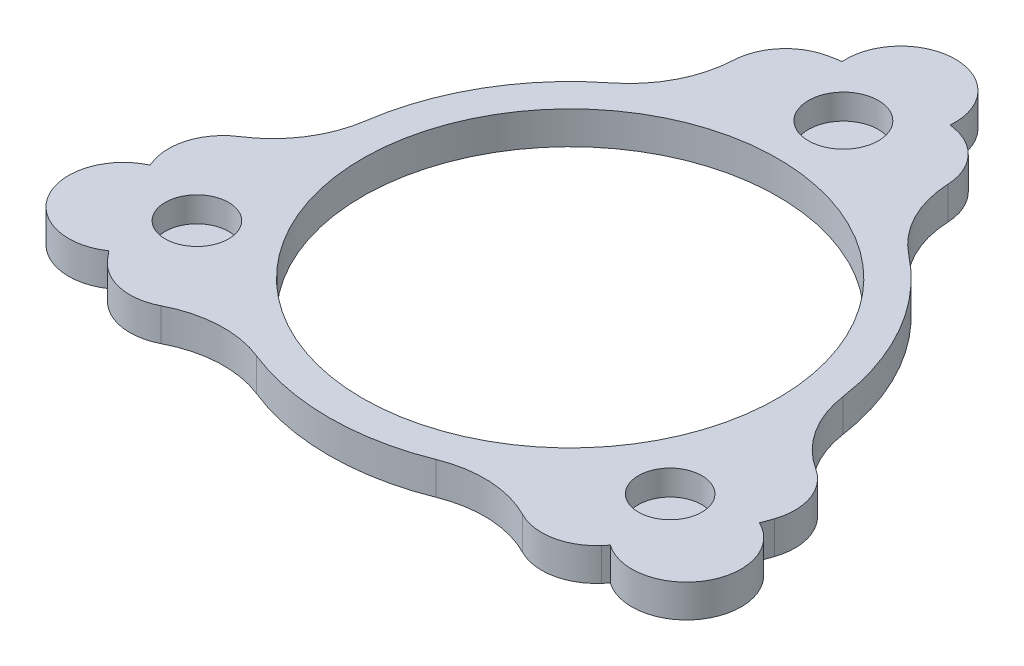
ISO-10303-21;
HEADER;
FILE_DESCRIPTION(('STEP AP214'),'2;1');
FILE_NAME('part.step','',(''),(''),'','','');
FILE_SCHEMA(('AUTOMOTIVE_DESIGN { 1 0 10303 214 1 1 1 1 }'));
ENDSEC;
DATA;
#1=APPLICATION_CONTEXT('core data for automotive mechanical design processes');
#2=APPLICATION_PROTOCOL_DEFINITION('international standard','automotive_design',2000,#1);
#3=PRODUCT_CONTEXT('',#1,'mechanical');
#4=PRODUCT('Part','Part','',(#3));
#5=PRODUCT_RELATED_PRODUCT_CATEGORY('part','',(#4));
#6=PRODUCT_DEFINITION_FORMATION('','',#4);
#7=PRODUCT_DEFINITION_CONTEXT('part definition',#1,'design');
#8=PRODUCT_DEFINITION('design','',#6,#7);
#9=PRODUCT_DEFINITION_SHAPE('','',#8);
#10=(LENGTH_UNIT() NAMED_UNIT(*) SI_UNIT(.MILLI.,.METRE.));
#11=(NAMED_UNIT(*) PLANE_ANGLE_UNIT() SI_UNIT($,.RADIAN.));
#12=(NAMED_UNIT(*) SI_UNIT($,.STERADIAN.) SOLID_ANGLE_UNIT());
#13=UNCERTAINTY_MEASURE_WITH_UNIT(LENGTH_MEASURE(1.E-05),#10,'distance_accuracy_value','');
#14=(GEOMETRIC_REPRESENTATION_CONTEXT(3) GLOBAL_UNCERTAINTY_ASSIGNED_CONTEXT((#13)) GLOBAL_UNIT_ASSIGNED_CONTEXT((#10,
#11,#12)) REPRESENTATION_CONTEXT('',''));
#15=CARTESIAN_POINT('',(0.,0.,0.));
#16=DIRECTION('',(0.,0.,1.));
#17=DIRECTION('',(1.,0.,0.));
#18=AXIS2_PLACEMENT_3D('',#15,#16,#17);
#19=CARTESIAN_POINT('',(0.,3.,0.));
#20=DIRECTION('',(0.,-1.,0.));
#21=DIRECTION('',(0.,0.,-1.));
#22=AXIS2_PLACEMENT_3D('',#19,#20,#21);
#23=CYLINDRICAL_SURFACE('',#22,30.);
#24=CARTESIAN_POINT('',(0.,3.,0.));
#25=DIRECTION('',(0.,1.,0.));
#26=DIRECTION('',(0.,0.,1.));
#27=AXIS2_PLACEMENT_3D('',#24,#25,#26);
#28=CIRCLE('',#27,30.);
#29=CARTESIAN_POINT('',(22.5987122307723,3.,19.7306412848327));
#30=VERTEX_POINT('',#29);
#31=CARTESIAN_POINT('',(22.9708708954916,3.,19.2960900262892));
#32=VERTEX_POINT('',#31);
#33=EDGE_CURVE('E250',#30,#32,#28,.T.);
#34=ORIENTED_EDGE('',*,*,#33,.F.);
#35=DIRECTION('',(0.,-1.,0.));
#36=VECTOR('',#35,1.);
#37=CARTESIAN_POINT('',(22.5987122307723,3.,19.7306412848327));
#38=LINE('',#37,#36);
#39=CARTESIAN_POINT('',(22.5987122307723,0.,19.7306412848327));
#40=VERTEX_POINT('',#39);
#41=EDGE_CURVE('E393',#30,#40,#38,.T.);
#42=ORIENTED_EDGE('',*,*,#41,.T.);
#43=CARTESIAN_POINT('',(0.,0.,0.));
#44=DIRECTION('',(0.,1.,0.));
#45=DIRECTION('',(0.,0.,1.));
#46=AXIS2_PLACEMENT_3D('',#43,#44,#45);
#47=CIRCLE('',#46,30.);
#48=CARTESIAN_POINT('',(22.9708708954916,0.,19.2960900262892));
#49=VERTEX_POINT('',#48);
#50=EDGE_CURVE('E220',#40,#49,#47,.T.);
#51=ORIENTED_EDGE('',*,*,#50,.T.);
#52=DIRECTION('',(0.,1.,0.));
#53=VECTOR('',#52,1.);
#54=CARTESIAN_POINT('',(22.9708708954916,1.5,19.2960900262892));
#55=LINE('',#54,#53);
#56=EDGE_CURVE('E206',#49,#32,#55,.T.);
#57=ORIENTED_EDGE('',*,*,#56,.T.);
#58=EDGE_LOOP('',(#34,#42,#51,#57));
#59=FACE_BOUND('',#58,.T.);
#60=ADVANCED_FACE('F35',(#59),#23,.T.);
#61=CARTESIAN_POINT('',(5.78788047023686,3.,-29.4363795270793));
#62=VERTEX_POINT('',#61);
#63=CARTESIAN_POINT('',(5.22546870873223,3.,-29.5414027556929));
#64=VERTEX_POINT('',#63);
#65=EDGE_CURVE('E243',#62,#64,#28,.T.);
#66=ORIENTED_EDGE('',*,*,#65,.F.);
#67=DIRECTION('',(0.,-1.,0.));
#68=VECTOR('',#67,1.);
#69=CARTESIAN_POINT('',(5.78788047023686,3.,-29.4363795270793));
#70=LINE('',#69,#68);
#71=CARTESIAN_POINT('',(5.78788047023686,0.,-29.4363795270793));
#72=VERTEX_POINT('',#71);
#73=EDGE_CURVE('E11',#62,#72,#70,.T.);
#74=ORIENTED_EDGE('',*,*,#73,.T.);
#75=CARTESIAN_POINT('',(5.22546870873223,0.,-29.5414027556929));
#76=VERTEX_POINT('',#75);
#77=EDGE_CURVE('E221',#72,#76,#47,.T.);
#78=ORIENTED_EDGE('',*,*,#77,.T.);
#79=DIRECTION('',(0.,1.,0.));
#80=VECTOR('',#79,1.);
#81=CARTESIAN_POINT('',(5.22546870873223,1.5,-29.5414027556929));
#82=LINE('',#81,#80);
#83=EDGE_CURVE('E273',#76,#64,#82,.T.);
#84=ORIENTED_EDGE('',*,*,#83,.T.);
#85=EDGE_LOOP('',(#66,#74,#78,#84));
#86=FACE_BOUND('',#85,.T.);
#87=ADVANCED_FACE('F442',(#86),#23,.T.);
#88=CARTESIAN_POINT('',(0.,3.,0.));
#89=DIRECTION('',(0.,1.,0.));
#90=DIRECTION('',(0.,0.,1.));
#91=AXIS2_PLACEMENT_3D('',#88,#89,#90);
#92=PLANE('',#91);
#93=CARTESIAN_POINT('',(1.60090602130669E-12,3.,-24.9999999999991));
#94=DIRECTION('',(0.,1.,0.));
#95=DIRECTION('',(0.,0.,1.));
#96=AXIS2_PLACEMENT_3D('',#93,#94,#95);
#97=CIRCLE('',#96,3.2);
#98=CARTESIAN_POINT('',(1.60090602130669E-12,3.,-21.7999999999991));
#99=VERTEX_POINT('',#98);
#100=EDGE_CURVE('E422',#99,#99,#97,.T.);
#101=ORIENTED_EDGE('',*,*,#100,.F.);
#102=EDGE_LOOP('',(#101));
#103=FACE_BOUND('',#102,.T.);
#104=CARTESIAN_POINT('',(21.650635094611,3.,12.5000000000018));
#105=DIRECTION('',(0.,1.,0.));
#106=DIRECTION('',(0.,0.,1.));
#107=AXIS2_PLACEMENT_3D('',#104,#105,#106);
#108=CIRCLE('',#107,2.9);
#109=CARTESIAN_POINT('',(21.650635094611,3.,15.4000000000018));
#110=VERTEX_POINT('',#109);
#111=EDGE_CURVE('E428',#110,#110,#108,.T.);
#112=ORIENTED_EDGE('',*,*,#111,.F.);
#113=EDGE_LOOP('',(#112));
#114=FACE_BOUND('',#113,.T.);
#115=CARTESIAN_POINT('',(-21.650635094611,3.,12.5));
#116=DIRECTION('',(0.,1.,0.));
#117=DIRECTION('',(0.,0.,1.));
#118=AXIS2_PLACEMENT_3D('',#115,#116,#117);
#119=CIRCLE('',#118,2.9);
#120=CARTESIAN_POINT('',(-21.650635094611,3.,15.4));
#121=VERTEX_POINT('',#120);
#122=EDGE_CURVE('E415',#121,#121,#119,.T.);
#123=ORIENTED_EDGE('',*,*,#122,.F.);
#124=EDGE_LOOP('',(#123));
#125=FACE_BOUND('',#124,.T.);
#126=CARTESIAN_POINT('',(0.,3.,0.));
#127=DIRECTION('',(0.,1.,0.));
#128=DIRECTION('',(0.,0.,1.));
#129=AXIS2_PLACEMENT_3D('',#126,#127,#128);
#130=CIRCLE('',#129,19.);
#131=CARTESIAN_POINT('',(0.,3.,19.));
#132=VERTEX_POINT('',#131);
#133=EDGE_CURVE('E260',#132,#132,#130,.T.);
#134=ORIENTED_EDGE('',*,*,#133,.F.);
#135=EDGE_LOOP('',(#134));
#136=FACE_BOUND('',#135,.T.);
#137=CARTESIAN_POINT('',(-4.73941231097717,3.,-29.6232673914705));
#138=VERTEX_POINT('',#137);
#139=CARTESIAN_POINT('',(-5.78788047023531,3.,-29.4363795270796));
#140=VERTEX_POINT('',#139);
#141=EDGE_CURVE('E242',#138,#140,#28,.T.);
#142=ORIENTED_EDGE('',*,*,#141,.T.);
#143=CARTESIAN_POINT('',(-4.82323372519609,3.,-24.5303162725663));
#144=DIRECTION('',(0.,1.,0.));
#145=DIRECTION('',(0.,0.,1.));
#146=AXIS2_PLACEMENT_3D('',#143,#144,#145);
#147=CIRCLE('',#146,5.);
#148=CARTESIAN_POINT('',(-9.81802138609295,3.,-24.7585622419778));
#149=VERTEX_POINT('',#148);
#150=EDGE_CURVE('E366',#140,#149,#147,.T.);
#151=ORIENTED_EDGE('',*,*,#150,.T.);
#152=CARTESIAN_POINT('',(-19.8075967078866,3.,-25.2150541808007));
#153=DIRECTION('',(0.,1.,0.));
#154=DIRECTION('',(0.,0.,1.));
#155=AXIS2_PLACEMENT_3D('',#152,#153,#154);
#156=CIRCLE('',#155,10.);
#157=CARTESIAN_POINT('',(-13.6301971895271,3.,-17.3512297174386));
#158=VERTEX_POINT('',#157);
#159=EDGE_CURVE('E351',#149,#158,#156,.F.);
#160=ORIENTED_EDGE('',*,*,#159,.T.);
#161=CARTESIAN_POINT('',(0.,3.,0.));
#162=DIRECTION('',(0.,1.,0.));
#163=DIRECTION('',(0.,0.,1.));
#164=AXIS2_PLACEMENT_3D('',#161,#162,#163);
#165=CIRCLE('',#164,22.0646198275139);
#166=CARTESIAN_POINT('',(-21.8417043169647,3.,-3.12848216600344));
#167=VERTEX_POINT('',#166);
#168=EDGE_CURVE('E411',#158,#167,#165,.T.);
#169=ORIENTED_EDGE('',*,*,#168,.T.);
#170=CARTESIAN_POINT('',(-31.7406758323175,3.,-4.54635484654804));
#171=DIRECTION('',(0.,1.,0.));
#172=DIRECTION('',(0.,0.,1.));
#173=AXIS2_PLACEMENT_3D('',#170,#171,#172);
#174=CIRCLE('',#173,10.);
#175=CARTESIAN_POINT('',(-26.3505545557776,3.,3.87662518573222));
#176=VERTEX_POINT('',#175);
#177=EDGE_CURVE('E327',#167,#176,#174,.F.);
#178=ORIENTED_EDGE('',*,*,#177,.T.);
#179=CARTESIAN_POINT('',(-23.6554939175076,3.,8.08811520187234));
#180=DIRECTION('',(0.,1.,0.));
#181=DIRECTION('',(0.,0.,1.));
#182=AXIS2_PLACEMENT_3D('',#179,#180,#181);
#183=CIRCLE('',#182,5.);
#184=CARTESIAN_POINT('',(-28.3865927010092,3.,9.70573824224681));
#185=VERTEX_POINT('',#184);
#186=EDGE_CURVE('E364',#176,#185,#183,.T.);
#187=ORIENTED_EDGE('',*,*,#186,.T.);
#188=CARTESIAN_POINT('',(-28.1963396042238,3.,10.2453127294037));
#189=VERTEX_POINT('',#188);
#190=EDGE_CURVE('E236',#185,#189,#28,.T.);
#191=ORIENTED_EDGE('',*,*,#190,.T.);
#192=CARTESIAN_POINT('',(-26.1031109845426,3.,14.7860608996667));
#193=DIRECTION('',(0.,1.,0.));
#194=DIRECTION('',(0.,0.,1.));
#195=AXIS2_PLACEMENT_3D('',#192,#193,#194);
#196=CIRCLE('',#195,5.);
#197=CARTESIAN_POINT('',(-23.284795948624,3.,18.9160851560502));
#198=VERTEX_POINT('',#197);
#199=EDGE_CURVE('E276',#189,#198,#196,.T.);
#200=ORIENTED_EDGE('',*,*,#199,.T.);
#201=CARTESIAN_POINT('',(-22.5987122307734,3.,19.7306412848314));
#202=VERTEX_POINT('',#201);
#203=EDGE_CURVE('E244',#198,#202,#28,.T.);
#204=ORIENTED_EDGE('',*,*,#203,.T.);
#205=CARTESIAN_POINT('',(-18.8322601923112,3.,16.4422010706928));
#206=DIRECTION('',(0.,1.,0.));
#207=DIRECTION('',(0.,0.,1.));
#208=AXIS2_PLACEMENT_3D('',#205,#206,#207);
#209=CIRCLE('',#208,5.);
#210=CARTESIAN_POINT('',(-16.5325331696845,3.,20.8819370562443));
#211=VERTEX_POINT('',#210);
#212=EDGE_CURVE('E362',#202,#211,#209,.T.);
#213=ORIENTED_EDGE('',*,*,#212,.T.);
#214=CARTESIAN_POINT('',(-11.9330791244311,3.,29.7614090273472));
#215=DIRECTION('',(0.,1.,0.));
#216=DIRECTION('',(0.,0.,1.));
#217=AXIS2_PLACEMENT_3D('',#214,#215,#216);
#218=CIRCLE('',#217,10.);
#219=CARTESIAN_POINT('',(-8.21150712743779,3.,20.479711883441));
#220=VERTEX_POINT('',#219);
#221=EDGE_CURVE('E332',#211,#220,#218,.F.);
#222=ORIENTED_EDGE('',*,*,#221,.T.);
#223=CARTESIAN_POINT('',(0.,3.,0.));
#224=DIRECTION('',(0.,1.,0.));
#225=DIRECTION('',(0.,0.,1.));
#226=AXIS2_PLACEMENT_3D('',#223,#224,#225);
#227=CIRCLE('',#226,22.0646198275139);
#228=CARTESIAN_POINT('',(8.21150712743663,3.,20.4797118834415));
#229=VERTEX_POINT('',#228);
#230=EDGE_CURVE('E412',#220,#229,#227,.T.);
#231=ORIENTED_EDGE('',*,*,#230,.T.);
#232=CARTESIAN_POINT('',(11.9330791244294,3.,29.7614090273479));
#233=DIRECTION('',(0.,1.,0.));
#234=DIRECTION('',(0.,0.,1.));
#235=AXIS2_PLACEMENT_3D('',#232,#233,#234);
#236=CIRCLE('',#235,10.);
#237=CARTESIAN_POINT('',(16.5325331696833,3.,20.8819370562452));
#238=VERTEX_POINT('',#237);
#239=EDGE_CURVE('E337',#229,#238,#236,.F.);
#240=ORIENTED_EDGE('',*,*,#239,.T.);
#241=CARTESIAN_POINT('',(18.8322601923102,3.,16.4422010706939));
#242=DIRECTION('',(0.,1.,0.));
#243=DIRECTION('',(0.,0.,1.));
#244=AXIS2_PLACEMENT_3D('',#241,#242,#243);
#245=CIRCLE('',#244,5.);
#246=EDGE_CURVE('E360',#238,#30,#245,.T.);
#247=ORIENTED_EDGE('',*,*,#246,.T.);
#248=ORIENTED_EDGE('',*,*,#33,.T.);
#249=CARTESIAN_POINT('',(25.8566598532865,3.,15.2129267805851));
#250=DIRECTION('',(0.,1.,0.));
#251=DIRECTION('',(0.,0.,1.));
#252=AXIS2_PLACEMENT_3D('',#249,#250,#251);
#253=CIRCLE('',#252,5.);
#254=CARTESIAN_POINT('',(28.0242082596012,3.,10.7071822354203));
#255=VERTEX_POINT('',#254);
#256=EDGE_CURVE('E208',#32,#255,#253,.T.);
#257=ORIENTED_EDGE('',*,*,#256,.T.);
#258=CARTESIAN_POINT('',(28.3865927010087,3.,9.70573824224818));
#259=VERTEX_POINT('',#258);
#260=EDGE_CURVE('E216',#255,#259,#28,.T.);
#261=ORIENTED_EDGE('',*,*,#260,.T.);
#262=CARTESIAN_POINT('',(23.6554939175073,3.,8.08811520187348));
#263=DIRECTION('',(0.,1.,0.));
#264=DIRECTION('',(0.,0.,1.));
#265=AXIS2_PLACEMENT_3D('',#262,#263,#264);
#266=CIRCLE('',#265,5.);
#267=CARTESIAN_POINT('',(26.3505545557774,3.,3.87662518573348));
#268=VERTEX_POINT('',#267);
#269=EDGE_CURVE('E259',#259,#268,#266,.T.);
#270=ORIENTED_EDGE('',*,*,#269,.T.);
#271=CARTESIAN_POINT('',(31.7406758323177,3.,-4.54635484654652));
#272=DIRECTION('',(0.,1.,0.));
#273=DIRECTION('',(0.,0.,1.));
#274=AXIS2_PLACEMENT_3D('',#271,#272,#273);
#275=CIRCLE('',#274,10.);
#276=CARTESIAN_POINT('',(21.8417043169649,3.,-3.1284821660024));
#277=VERTEX_POINT('',#276);
#278=EDGE_CURVE('E342',#268,#277,#275,.F.);
#279=ORIENTED_EDGE('',*,*,#278,.T.);
#280=CARTESIAN_POINT('',(0.,3.,0.));
#281=DIRECTION('',(0.,1.,0.));
#282=DIRECTION('',(0.,0.,1.));
#283=AXIS2_PLACEMENT_3D('',#280,#281,#282);
#284=CIRCLE('',#283,22.0646198275139);
#285=CARTESIAN_POINT('',(13.630197189528,3.,-17.3512297174379));
#286=VERTEX_POINT('',#285);
#287=EDGE_CURVE('E408',#277,#286,#284,.T.);
#288=ORIENTED_EDGE('',*,*,#287,.T.);
#289=CARTESIAN_POINT('',(19.807596707888,3.,-25.2150541807996));
#290=DIRECTION('',(0.,1.,0.));
#291=DIRECTION('',(0.,0.,1.));
#292=AXIS2_PLACEMENT_3D('',#289,#290,#291);
#293=CIRCLE('',#292,10.);
#294=CARTESIAN_POINT('',(9.81802138609424,3.,-24.7585622419772));
#295=VERTEX_POINT('',#294);
#296=EDGE_CURVE('E346',#286,#295,#293,.F.);
#297=ORIENTED_EDGE('',*,*,#296,.T.);
#298=CARTESIAN_POINT('',(4.82323372519738,3.,-24.530316272566));
#299=DIRECTION('',(0.,1.,0.));
#300=DIRECTION('',(0.,0.,1.));
#301=AXIS2_PLACEMENT_3D('',#298,#299,#300);
#302=CIRCLE('',#301,5.);
#303=EDGE_CURVE('E357',#295,#62,#302,.T.);
#304=ORIENTED_EDGE('',*,*,#303,.T.);
#305=ORIENTED_EDGE('',*,*,#65,.T.);
#306=CARTESIAN_POINT('',(0.246451131256085,3.,-29.9989876802519));
#307=DIRECTION('',(0.,1.,0.));
#308=DIRECTION('',(0.,0.,1.));
#309=AXIS2_PLACEMENT_3D('',#306,#307,#308);
#310=CIRCLE('',#309,5.);
#311=EDGE_CURVE('E267',#64,#138,#310,.T.);
#312=ORIENTED_EDGE('',*,*,#311,.T.);
#313=EDGE_LOOP('',(#142,#151,#160,#169,#178,#187,#191,#200,#204,#213,#222,#231,#240,#247,#248,
#257,#261,#270,#279,#288,#297,#304,#305,#312));
#314=FACE_BOUND('',#313,.T.);
#315=ADVANCED_FACE('F258',(#103,#114,#125,#136,#314),#92,.T.);
#316=ORIENTED_EDGE('',*,*,#190,.F.);
#317=DIRECTION('',(0.,-1.,0.));
#318=VECTOR('',#317,1.);
#319=CARTESIAN_POINT('',(-28.3865927010092,3.,9.70573824224681));
#320=LINE('',#319,#318);
#321=CARTESIAN_POINT('',(-28.3865927010092,0.,9.70573824224681));
#322=VERTEX_POINT('',#321);
#323=EDGE_CURVE('E384',#185,#322,#320,.T.);
#324=ORIENTED_EDGE('',*,*,#323,.T.);
#325=CARTESIAN_POINT('',(-28.1963396042238,0.,10.2453127294037));
#326=VERTEX_POINT('',#325);
#327=EDGE_CURVE('E225',#322,#326,#47,.T.);
#328=ORIENTED_EDGE('',*,*,#327,.T.);
#329=DIRECTION('',(0.,1.,0.));
#330=VECTOR('',#329,1.);
#331=CARTESIAN_POINT('',(-28.1963396042238,1.5,10.2453127294037));
#332=LINE('',#331,#330);
#333=EDGE_CURVE('E282',#326,#189,#332,.T.);
#334=ORIENTED_EDGE('',*,*,#333,.T.);
#335=EDGE_LOOP('',(#316,#324,#328,#334));
#336=FACE_BOUND('',#335,.T.);
#337=ADVANCED_FACE('F441',(#336),#23,.T.);
#338=CARTESIAN_POINT('',(0.,0.,0.));
#339=DIRECTION('',(0.,1.,0.));
#340=DIRECTION('',(0.,0.,1.));
#341=AXIS2_PLACEMENT_3D('',#338,#339,#340);
#342=PLANE('',#341);
#343=CARTESIAN_POINT('',(0.,0.,0.));
#344=DIRECTION('',(0.,1.,0.));
#345=DIRECTION('',(0.,0.,1.));
#346=AXIS2_PLACEMENT_3D('',#343,#344,#345);
#347=CIRCLE('',#346,19.);
#348=CARTESIAN_POINT('',(0.,0.,19.));
#349=VERTEX_POINT('',#348);
#350=EDGE_CURVE('E263',#349,#349,#347,.T.);
#351=ORIENTED_EDGE('',*,*,#350,.T.);
#352=EDGE_LOOP('',(#351));
#353=FACE_BOUND('',#352,.T.);
#354=CARTESIAN_POINT('',(21.650635094611,0.,12.5000000000018));
#355=DIRECTION('',(0.,1.,0.));
#356=DIRECTION('',(0.,0.,1.));
#357=AXIS2_PLACEMENT_3D('',#354,#355,#356);
#358=CIRCLE('',#357,2.9);
#359=CARTESIAN_POINT('',(21.650635094611,0.,15.4000000000018));
#360=VERTEX_POINT('',#359);
#361=EDGE_CURVE('E291',#360,#360,#358,.T.);
#362=ORIENTED_EDGE('',*,*,#361,.T.);
#363=EDGE_LOOP('',(#362));
#364=FACE_BOUND('',#363,.T.);
#365=CARTESIAN_POINT('',(-21.650635094611,0.,12.5));
#366=DIRECTION('',(0.,1.,0.));
#367=DIRECTION('',(0.,0.,1.));
#368=AXIS2_PLACEMENT_3D('',#365,#366,#367);
#369=CIRCLE('',#368,2.9);
#370=CARTESIAN_POINT('',(-21.650635094611,0.,15.4));
#371=VERTEX_POINT('',#370);
#372=EDGE_CURVE('E234',#371,#371,#369,.T.);
#373=ORIENTED_EDGE('',*,*,#372,.T.);
#374=EDGE_LOOP('',(#373));
#375=FACE_BOUND('',#374,.T.);
#376=CARTESIAN_POINT('',(1.60090602130669E-12,0.,-24.9999999999991));
#377=DIRECTION('',(0.,1.,0.));
#378=DIRECTION('',(0.,0.,1.));
#379=AXIS2_PLACEMENT_3D('',#376,#377,#378);
#380=CIRCLE('',#379,2.9);
#381=CARTESIAN_POINT('',(1.60090602130669E-12,0.,-22.0999999999991));
#382=VERTEX_POINT('',#381);
#383=EDGE_CURVE('E288',#382,#382,#380,.T.);
#384=ORIENTED_EDGE('',*,*,#383,.T.);
#385=EDGE_LOOP('',(#384));
#386=FACE_BOUND('',#385,.T.);
#387=CARTESIAN_POINT('',(-19.8075967078866,0.,-25.2150541808007));
#388=DIRECTION('',(0.,1.,0.));
#389=DIRECTION('',(0.,0.,1.));
#390=AXIS2_PLACEMENT_3D('',#387,#388,#389);
#391=CIRCLE('',#390,10.);
#392=CARTESIAN_POINT('',(-13.6301971895271,0.,-17.3512297174386));
#393=VERTEX_POINT('',#392);
#394=CARTESIAN_POINT('',(-9.81802138609295,0.,-24.7585622419778));
#395=VERTEX_POINT('',#394);
#396=EDGE_CURVE('E353',#393,#395,#391,.T.);
#397=ORIENTED_EDGE('',*,*,#396,.T.);
#398=CARTESIAN_POINT('',(-4.82323372519609,0.,-24.5303162725663));
#399=DIRECTION('',(0.,1.,0.));
#400=DIRECTION('',(0.,0.,1.));
#401=AXIS2_PLACEMENT_3D('',#398,#399,#400);
#402=CIRCLE('',#401,5.);
#403=CARTESIAN_POINT('',(-5.78788047023531,0.,-29.4363795270796));
#404=VERTEX_POINT('',#403);
#405=EDGE_CURVE('E379',#395,#404,#402,.F.);
#406=ORIENTED_EDGE('',*,*,#405,.T.);
#407=CARTESIAN_POINT('',(-4.73941231097717,0.,-29.6232673914705));
#408=VERTEX_POINT('',#407);
#409=EDGE_CURVE('E223',#408,#404,#47,.T.);
#410=ORIENTED_EDGE('',*,*,#409,.F.);
#411=CARTESIAN_POINT('',(0.246451131256085,0.,-29.9989876802519));
#412=DIRECTION('',(0.,1.,0.));
#413=DIRECTION('',(0.,0.,1.));
#414=AXIS2_PLACEMENT_3D('',#411,#412,#413);
#415=CIRCLE('',#414,5.);
#416=EDGE_CURVE('E268',#76,#408,#415,.T.);
#417=ORIENTED_EDGE('',*,*,#416,.F.);
#418=ORIENTED_EDGE('',*,*,#77,.F.);
#419=CARTESIAN_POINT('',(4.82323372519738,0.,-24.530316272566));
#420=DIRECTION('',(0.,1.,0.));
#421=DIRECTION('',(0.,0.,1.));
#422=AXIS2_PLACEMENT_3D('',#419,#420,#421);
#423=CIRCLE('',#422,5.);
#424=CARTESIAN_POINT('',(9.81802138609424,0.,-24.7585622419772));
#425=VERTEX_POINT('',#424);
#426=EDGE_CURVE('E370',#72,#425,#423,.F.);
#427=ORIENTED_EDGE('',*,*,#426,.T.);
#428=CARTESIAN_POINT('',(19.807596707888,0.,-25.2150541807996));
#429=DIRECTION('',(0.,1.,0.));
#430=DIRECTION('',(0.,0.,1.));
#431=AXIS2_PLACEMENT_3D('',#428,#429,#430);
#432=CIRCLE('',#431,10.);
#433=CARTESIAN_POINT('',(13.630197189528,0.,-17.3512297174379));
#434=VERTEX_POINT('',#433);
#435=EDGE_CURVE('E349',#425,#434,#432,.T.);
#436=ORIENTED_EDGE('',*,*,#435,.T.);
#437=CARTESIAN_POINT('',(0.,0.,0.));
#438=DIRECTION('',(0.,1.,0.));
#439=DIRECTION('',(0.,0.,1.));
#440=AXIS2_PLACEMENT_3D('',#437,#438,#439);
#441=CIRCLE('',#440,22.0646198275139);
#442=CARTESIAN_POINT('',(21.8417043169649,0.,-3.1284821660024));
#443=VERTEX_POINT('',#442);
#444=EDGE_CURVE('E255',#443,#434,#441,.T.);
#445=ORIENTED_EDGE('',*,*,#444,.F.);
#446=CARTESIAN_POINT('',(31.7406758323177,0.,-4.54635484654652));
#447=DIRECTION('',(0.,1.,0.));
#448=DIRECTION('',(0.,0.,1.));
#449=AXIS2_PLACEMENT_3D('',#446,#447,#448);
#450=CIRCLE('',#449,10.);
#451=CARTESIAN_POINT('',(26.3505545557774,0.,3.87662518573348));
#452=VERTEX_POINT('',#451);
#453=EDGE_CURVE('E344',#443,#452,#450,.T.);
#454=ORIENTED_EDGE('',*,*,#453,.T.);
#455=CARTESIAN_POINT('',(23.6554939175073,0.,8.08811520187348));
#456=DIRECTION('',(0.,1.,0.));
#457=DIRECTION('',(0.,0.,1.));
#458=AXIS2_PLACEMENT_3D('',#455,#456,#457);
#459=CIRCLE('',#458,5.);
#460=CARTESIAN_POINT('',(28.3865927010087,0.,9.70573824224818));
#461=VERTEX_POINT('',#460);
#462=EDGE_CURVE('E50',#452,#461,#459,.F.);
#463=ORIENTED_EDGE('',*,*,#462,.T.);
#464=CARTESIAN_POINT('',(28.0242082596012,0.,10.7071822354203));
#465=VERTEX_POINT('',#464);
#466=EDGE_CURVE('E213',#465,#461,#47,.T.);
#467=ORIENTED_EDGE('',*,*,#466,.F.);
#468=CARTESIAN_POINT('',(25.8566598532865,0.,15.2129267805851));
#469=DIRECTION('',(0.,1.,0.));
#470=DIRECTION('',(0.,0.,1.));
#471=AXIS2_PLACEMENT_3D('',#468,#469,#470);
#472=CIRCLE('',#471,5.);
#473=EDGE_CURVE('E199',#49,#465,#472,.T.);
#474=ORIENTED_EDGE('',*,*,#473,.F.);
#475=ORIENTED_EDGE('',*,*,#50,.F.);
#476=CARTESIAN_POINT('',(18.8322601923102,0.,16.4422010706939));
#477=DIRECTION('',(0.,1.,0.));
#478=DIRECTION('',(0.,0.,1.));
#479=AXIS2_PLACEMENT_3D('',#476,#477,#478);
#480=CIRCLE('',#479,5.);
#481=CARTESIAN_POINT('',(16.5325331696833,0.,20.8819370562452));
#482=VERTEX_POINT('',#481);
#483=EDGE_CURVE('E373',#40,#482,#480,.F.);
#484=ORIENTED_EDGE('',*,*,#483,.T.);
#485=CARTESIAN_POINT('',(11.9330791244294,0.,29.7614090273479));
#486=DIRECTION('',(0.,1.,0.));
#487=DIRECTION('',(0.,0.,1.));
#488=AXIS2_PLACEMENT_3D('',#485,#486,#487);
#489=CIRCLE('',#488,10.);
#490=CARTESIAN_POINT('',(8.21150712743663,0.,20.4797118834415));
#491=VERTEX_POINT('',#490);
#492=EDGE_CURVE('E340',#482,#491,#489,.T.);
#493=ORIENTED_EDGE('',*,*,#492,.T.);
#494=CARTESIAN_POINT('',(0.,0.,0.));
#495=DIRECTION('',(0.,1.,0.));
#496=DIRECTION('',(0.,0.,1.));
#497=AXIS2_PLACEMENT_3D('',#494,#495,#496);
#498=CIRCLE('',#497,22.0646198275139);
#499=CARTESIAN_POINT('',(-8.21150712743779,0.,20.479711883441));
#500=VERTEX_POINT('',#499);
#501=EDGE_CURVE('E309',#500,#491,#498,.T.);
#502=ORIENTED_EDGE('',*,*,#501,.F.);
#503=CARTESIAN_POINT('',(-11.9330791244311,0.,29.7614090273472));
#504=DIRECTION('',(0.,1.,0.));
#505=DIRECTION('',(0.,0.,1.));
#506=AXIS2_PLACEMENT_3D('',#503,#504,#505);
#507=CIRCLE('',#506,10.);
#508=CARTESIAN_POINT('',(-16.5325331696845,0.,20.8819370562443));
#509=VERTEX_POINT('',#508);
#510=EDGE_CURVE('E334',#500,#509,#507,.T.);
#511=ORIENTED_EDGE('',*,*,#510,.T.);
#512=CARTESIAN_POINT('',(-18.8322601923112,0.,16.4422010706928));
#513=DIRECTION('',(0.,1.,0.));
#514=DIRECTION('',(0.,0.,1.));
#515=AXIS2_PLACEMENT_3D('',#512,#513,#514);
#516=CIRCLE('',#515,5.);
#517=CARTESIAN_POINT('',(-22.5987122307734,0.,19.7306412848314));
#518=VERTEX_POINT('',#517);
#519=EDGE_CURVE('E375',#509,#518,#516,.F.);
#520=ORIENTED_EDGE('',*,*,#519,.T.);
#521=CARTESIAN_POINT('',(-23.284795948624,0.,18.9160851560502));
#522=VERTEX_POINT('',#521);
#523=EDGE_CURVE('E224',#522,#518,#47,.T.);
#524=ORIENTED_EDGE('',*,*,#523,.F.);
#525=CARTESIAN_POINT('',(-26.1031109845426,0.,14.7860608996667));
#526=DIRECTION('',(0.,1.,0.));
#527=DIRECTION('',(0.,0.,1.));
#528=AXIS2_PLACEMENT_3D('',#525,#526,#527);
#529=CIRCLE('',#528,5.);
#530=EDGE_CURVE('E277',#326,#522,#529,.T.);
#531=ORIENTED_EDGE('',*,*,#530,.F.);
#532=ORIENTED_EDGE('',*,*,#327,.F.);
#533=CARTESIAN_POINT('',(-23.6554939175076,0.,8.08811520187234));
#534=DIRECTION('',(0.,1.,0.));
#535=DIRECTION('',(0.,0.,1.));
#536=AXIS2_PLACEMENT_3D('',#533,#534,#535);
#537=CIRCLE('',#536,5.);
#538=CARTESIAN_POINT('',(-26.3505545557776,0.,3.87662518573222));
#539=VERTEX_POINT('',#538);
#540=EDGE_CURVE('E377',#322,#539,#537,.F.);
#541=ORIENTED_EDGE('',*,*,#540,.T.);
#542=CARTESIAN_POINT('',(-31.7406758323175,0.,-4.54635484654804));
#543=DIRECTION('',(0.,1.,0.));
#544=DIRECTION('',(0.,0.,1.));
#545=AXIS2_PLACEMENT_3D('',#542,#543,#544);
#546=CIRCLE('',#545,10.);
#547=CARTESIAN_POINT('',(-21.8417043169647,0.,-3.12848216600344));
#548=VERTEX_POINT('',#547);
#549=EDGE_CURVE('E330',#539,#548,#546,.T.);
#550=ORIENTED_EDGE('',*,*,#549,.T.);
#551=CARTESIAN_POINT('',(0.,0.,0.));
#552=DIRECTION('',(0.,1.,0.));
#553=DIRECTION('',(0.,0.,1.));
#554=AXIS2_PLACEMENT_3D('',#551,#552,#553);
#555=CIRCLE('',#554,22.0646198275139);
#556=EDGE_CURVE('E252',#393,#548,#555,.T.);
#557=ORIENTED_EDGE('',*,*,#556,.F.);
#558=EDGE_LOOP('',(#397,#406,#410,#417,#418,#427,#436,#445,#454,#463,#467,#474,#475,#484,#493,
#502,#511,#520,#524,#531,#532,#541,#550,#557));
#559=FACE_BOUND('',#558,.T.);
#560=ADVANCED_FACE('F219',(#353,#364,#375,#386,#559),#342,.F.);
#561=ORIENTED_EDGE('',*,*,#523,.T.);
#562=DIRECTION('',(0.,-1.,0.));
#563=VECTOR('',#562,1.);
#564=CARTESIAN_POINT('',(-22.5987122307734,3.,19.7306412848314));
#565=LINE('',#564,#563);
#566=EDGE_CURVE('E386',#518,#202,#565,.F.);
#567=ORIENTED_EDGE('',*,*,#566,.T.);
#568=ORIENTED_EDGE('',*,*,#203,.F.);
#569=DIRECTION('',(0.,1.,0.));
#570=VECTOR('',#569,1.);
#571=CARTESIAN_POINT('',(-23.284795948624,1.5,18.9160851560502));
#572=LINE('',#571,#570);
#573=EDGE_CURVE('E279',#198,#522,#572,.F.);
#574=ORIENTED_EDGE('',*,*,#573,.T.);
#575=EDGE_LOOP('',(#561,#567,#568,#574));
#576=FACE_BOUND('',#575,.T.);
#577=ADVANCED_FACE('F454',(#576),#23,.T.);
#578=ORIENTED_EDGE('',*,*,#466,.T.);
#579=DIRECTION('',(0.,-1.,0.));
#580=VECTOR('',#579,1.);
#581=CARTESIAN_POINT('',(28.3865927010087,3.,9.70573824224818));
#582=LINE('',#581,#580);
#583=EDGE_CURVE('E395',#461,#259,#582,.F.);
#584=ORIENTED_EDGE('',*,*,#583,.T.);
#585=ORIENTED_EDGE('',*,*,#260,.F.);
#586=DIRECTION('',(0.,1.,0.));
#587=VECTOR('',#586,1.);
#588=CARTESIAN_POINT('',(28.0242082596012,1.5,10.7071822354203));
#589=LINE('',#588,#587);
#590=EDGE_CURVE('E203',#255,#465,#589,.F.);
#591=ORIENTED_EDGE('',*,*,#590,.T.);
#592=EDGE_LOOP('',(#578,#584,#585,#591));
#593=FACE_BOUND('',#592,.T.);
#594=ADVANCED_FACE('F211',(#593),#23,.T.);
#595=ORIENTED_EDGE('',*,*,#409,.T.);
#596=DIRECTION('',(0.,-1.,0.));
#597=VECTOR('',#596,1.);
#598=CARTESIAN_POINT('',(-5.78788047023531,3.,-29.4363795270796));
#599=LINE('',#598,#597);
#600=EDGE_CURVE('E355',#404,#140,#599,.F.);
#601=ORIENTED_EDGE('',*,*,#600,.T.);
#602=ORIENTED_EDGE('',*,*,#141,.F.);
#603=DIRECTION('',(0.,1.,0.));
#604=VECTOR('',#603,1.);
#605=CARTESIAN_POINT('',(-4.73941231097717,1.5,-29.6232673914705));
#606=LINE('',#605,#604);
#607=EDGE_CURVE('E270',#138,#408,#606,.F.);
#608=ORIENTED_EDGE('',*,*,#607,.T.);
#609=EDGE_LOOP('',(#595,#601,#602,#608));
#610=FACE_BOUND('',#609,.T.);
#611=ADVANCED_FACE('F482',(#610),#23,.T.);
#612=CARTESIAN_POINT('',(-21.650635094611,-2.,12.5));
#613=DIRECTION('',(0.,-1.,0.));
#614=DIRECTION('',(0.,0.,-1.));
#615=AXIS2_PLACEMENT_3D('',#612,#613,#614);
#616=PLANE('',#615);
#617=CARTESIAN_POINT('',(-21.650635094611,-2.,12.5));
#618=DIRECTION('',(0.,-1.,0.));
#619=DIRECTION('',(0.,0.,-1.));
#620=AXIS2_PLACEMENT_3D('',#617,#618,#619);
#621=CIRCLE('',#620,2.9);
#622=CARTESIAN_POINT('',(-21.650635094611,-2.,9.60000000000001));
#623=VERTEX_POINT('',#622);
#624=EDGE_CURVE('E292',#623,#623,#621,.T.);
#625=ORIENTED_EDGE('',*,*,#624,.T.);
#626=EDGE_LOOP('',(#625));
#627=FACE_BOUND('',#626,.T.);
#628=ADVANCED_FACE('F488',(#627),#616,.T.);
#629=CARTESIAN_POINT('',(-21.650635094611,3.,12.5));
#630=DIRECTION('',(0.,-1.,0.));
#631=DIRECTION('',(0.,0.,-1.));
#632=AXIS2_PLACEMENT_3D('',#629,#630,#631);
#633=CYLINDRICAL_SURFACE('',#632,2.9);
#634=ORIENTED_EDGE('',*,*,#624,.F.);
#635=EDGE_LOOP('',(#634));
#636=FACE_BOUND('',#635,.T.);
#637=ORIENTED_EDGE('',*,*,#372,.F.);
#638=EDGE_LOOP('',(#637));
#639=FACE_BOUND('',#638,.T.);
#640=ADVANCED_FACE('F493',(#636,#639),#633,.T.);
#641=CARTESIAN_POINT('',(21.650635094611,-2.,12.5000000000018));
#642=DIRECTION('',(0.,-1.,0.));
#643=DIRECTION('',(0.,0.,-1.));
#644=AXIS2_PLACEMENT_3D('',#641,#642,#643);
#645=PLANE('',#644);
#646=CARTESIAN_POINT('',(21.650635094611,-2.,12.5000000000018));
#647=DIRECTION('',(0.,-1.,0.));
#648=DIRECTION('',(0.,0.,-1.));
#649=AXIS2_PLACEMENT_3D('',#646,#647,#648);
#650=CIRCLE('',#649,2.9);
#651=CARTESIAN_POINT('',(21.650635094611,-2.,9.60000000000185));
#652=VERTEX_POINT('',#651);
#653=EDGE_CURVE('E289',#652,#652,#650,.T.);
#654=ORIENTED_EDGE('',*,*,#653,.T.);
#655=EDGE_LOOP('',(#654));
#656=FACE_BOUND('',#655,.T.);
#657=ADVANCED_FACE('F789',(#656),#645,.T.);
#658=CARTESIAN_POINT('',(21.650635094611,3.,12.5000000000018));
#659=DIRECTION('',(0.,-1.,0.));
#660=DIRECTION('',(0.,0.,-1.));
#661=AXIS2_PLACEMENT_3D('',#658,#659,#660);
#662=CYLINDRICAL_SURFACE('',#661,2.9);
#663=ORIENTED_EDGE('',*,*,#653,.F.);
#664=EDGE_LOOP('',(#663));
#665=FACE_BOUND('',#664,.T.);
#666=ORIENTED_EDGE('',*,*,#361,.F.);
#667=EDGE_LOOP('',(#666));
#668=FACE_BOUND('',#667,.T.);
#669=ADVANCED_FACE('F474',(#665,#668),#662,.T.);
#670=CARTESIAN_POINT('',(1.60090602130669E-12,-2.,-24.9999999999991));
#671=DIRECTION('',(0.,-1.,0.));
#672=DIRECTION('',(0.,0.,-1.));
#673=AXIS2_PLACEMENT_3D('',#670,#671,#672);
#674=PLANE('',#673);
#675=CARTESIAN_POINT('',(1.60090602130669E-12,-2.,-24.9999999999991));
#676=DIRECTION('',(0.,-1.,0.));
#677=DIRECTION('',(0.,0.,-1.));
#678=AXIS2_PLACEMENT_3D('',#675,#676,#677);
#679=CIRCLE('',#678,2.9);
#680=CARTESIAN_POINT('',(1.60090602130669E-12,-2.,-27.8999999999991));
#681=VERTEX_POINT('',#680);
#682=EDGE_CURVE('E285',#681,#681,#679,.T.);
#683=ORIENTED_EDGE('',*,*,#682,.T.);
#684=EDGE_LOOP('',(#683));
#685=FACE_BOUND('',#684,.T.);
#686=ADVANCED_FACE('F464',(#685),#674,.T.);
#687=CARTESIAN_POINT('',(1.60090602130669E-12,3.,-24.9999999999991));
#688=DIRECTION('',(0.,-1.,0.));
#689=DIRECTION('',(0.,0.,-1.));
#690=AXIS2_PLACEMENT_3D('',#687,#688,#689);
#691=CYLINDRICAL_SURFACE('',#690,2.9);
#692=ORIENTED_EDGE('',*,*,#682,.F.);
#693=EDGE_LOOP('',(#692));
#694=FACE_BOUND('',#693,.T.);
#695=ORIENTED_EDGE('',*,*,#383,.F.);
#696=EDGE_LOOP('',(#695));
#697=FACE_BOUND('',#696,.T.);
#698=ADVANCED_FACE('F461',(#694,#697),#691,.T.);
#699=CARTESIAN_POINT('',(-26.1031109845426,0.,14.7860608996667));
#700=DIRECTION('',(0.,1.,0.));
#701=DIRECTION('',(0.,0.,1.));
#702=AXIS2_PLACEMENT_3D('',#699,#700,#701);
#703=CYLINDRICAL_SURFACE('',#702,5.);
#704=ORIENTED_EDGE('',*,*,#333,.F.);
#705=ORIENTED_EDGE('',*,*,#530,.T.);
#706=ORIENTED_EDGE('',*,*,#573,.F.);
#707=ORIENTED_EDGE('',*,*,#199,.F.);
#708=EDGE_LOOP('',(#704,#705,#706,#707));
#709=FACE_BOUND('',#708,.T.);
#710=ADVANCED_FACE('F463',(#709),#703,.T.);
#711=CARTESIAN_POINT('',(0.246451131256085,0.,-29.9989876802519));
#712=DIRECTION('',(0.,1.,0.));
#713=DIRECTION('',(0.,0.,1.));
#714=AXIS2_PLACEMENT_3D('',#711,#712,#713);
#715=CYLINDRICAL_SURFACE('',#714,5.);
#716=ORIENTED_EDGE('',*,*,#83,.F.);
#717=ORIENTED_EDGE('',*,*,#416,.T.);
#718=ORIENTED_EDGE('',*,*,#607,.F.);
#719=ORIENTED_EDGE('',*,*,#311,.F.);
#720=EDGE_LOOP('',(#716,#717,#718,#719));
#721=FACE_BOUND('',#720,.T.);
#722=ADVANCED_FACE('F471',(#721),#715,.T.);
#723=CARTESIAN_POINT('',(25.8566598532865,0.,15.2129267805851));
#724=DIRECTION('',(0.,1.,0.));
#725=DIRECTION('',(0.,0.,1.));
#726=AXIS2_PLACEMENT_3D('',#723,#724,#725);
#727=CYLINDRICAL_SURFACE('',#726,5.);
#728=ORIENTED_EDGE('',*,*,#56,.F.);
#729=ORIENTED_EDGE('',*,*,#473,.T.);
#730=ORIENTED_EDGE('',*,*,#590,.F.);
#731=ORIENTED_EDGE('',*,*,#256,.F.);
#732=EDGE_LOOP('',(#728,#729,#730,#731));
#733=FACE_BOUND('',#732,.T.);
#734=ADVANCED_FACE('F201',(#733),#727,.T.);
#735=CARTESIAN_POINT('',(0.,-6.5,0.));
#736=DIRECTION('',(0.,1.,0.));
#737=DIRECTION('',(0.,0.,1.));
#738=AXIS2_PLACEMENT_3D('',#735,#736,#737);
#739=CYLINDRICAL_SURFACE('',#738,19.);
#740=ORIENTED_EDGE('',*,*,#133,.T.);
#741=EDGE_LOOP('',(#740));
#742=FACE_BOUND('',#741,.T.);
#743=ORIENTED_EDGE('',*,*,#350,.F.);
#744=EDGE_LOOP('',(#743));
#745=FACE_BOUND('',#744,.T.);
#746=ADVANCED_FACE('F447',(#742,#745),#739,.F.);
#747=CARTESIAN_POINT('',(-21.650635094611,0.7,12.5));
#748=DIRECTION('',(0.,1.,0.));
#749=DIRECTION('',(0.,0.,1.));
#750=AXIS2_PLACEMENT_3D('',#747,#748,#749);
#751=CYLINDRICAL_SURFACE('',#750,2.9);
#752=CARTESIAN_POINT('',(-21.650635094611,0.7,12.5));
#753=DIRECTION('',(0.,1.,0.));
#754=DIRECTION('',(0.,0.,1.));
#755=AXIS2_PLACEMENT_3D('',#752,#753,#754);
#756=CIRCLE('',#755,2.9);
#757=CARTESIAN_POINT('',(-21.650635094611,0.7,15.4));
#758=VERTEX_POINT('',#757);
#759=EDGE_CURVE('E431',#758,#758,#756,.T.);
#760=ORIENTED_EDGE('',*,*,#759,.F.);
#761=EDGE_LOOP('',(#760));
#762=FACE_BOUND('',#761,.T.);
#763=ORIENTED_EDGE('',*,*,#122,.T.);
#764=EDGE_LOOP('',(#763));
#765=FACE_BOUND('',#764,.T.);
#766=ADVANCED_FACE('F437',(#762,#765),#751,.F.);
#767=CARTESIAN_POINT('',(-21.650635094611,0.7,12.5));
#768=DIRECTION('',(0.,1.,0.));
#769=DIRECTION('',(0.,0.,1.));
#770=AXIS2_PLACEMENT_3D('',#767,#768,#769);
#771=PLANE('',#770);
#772=ORIENTED_EDGE('',*,*,#759,.T.);
#773=EDGE_LOOP('',(#772));
#774=FACE_BOUND('',#773,.T.);
#775=ADVANCED_FACE('F603',(#774),#771,.T.);
#776=CARTESIAN_POINT('',(21.650635094611,0.7,12.5000000000018));
#777=DIRECTION('',(0.,1.,0.));
#778=DIRECTION('',(0.,0.,1.));
#779=AXIS2_PLACEMENT_3D('',#776,#777,#778);
#780=CYLINDRICAL_SURFACE('',#779,2.9);
#781=CARTESIAN_POINT('',(21.650635094611,0.7,12.5000000000018));
#782=DIRECTION('',(0.,1.,0.));
#783=DIRECTION('',(0.,0.,1.));
#784=AXIS2_PLACEMENT_3D('',#781,#782,#783);
#785=CIRCLE('',#784,2.9);
#786=CARTESIAN_POINT('',(21.650635094611,0.7,15.4000000000018));
#787=VERTEX_POINT('',#786);
#788=EDGE_CURVE('E425',#787,#787,#785,.T.);
#789=ORIENTED_EDGE('',*,*,#788,.F.);
#790=EDGE_LOOP('',(#789));
#791=FACE_BOUND('',#790,.T.);
#792=ORIENTED_EDGE('',*,*,#111,.T.);
#793=EDGE_LOOP('',(#792));
#794=FACE_BOUND('',#793,.T.);
#795=ADVANCED_FACE('F599',(#791,#794),#780,.F.);
#796=CARTESIAN_POINT('',(21.650635094611,0.7,12.5000000000018));
#797=DIRECTION('',(0.,1.,0.));
#798=DIRECTION('',(0.,0.,1.));
#799=AXIS2_PLACEMENT_3D('',#796,#797,#798);
#800=PLANE('',#799);
#801=ORIENTED_EDGE('',*,*,#788,.T.);
#802=EDGE_LOOP('',(#801));
#803=FACE_BOUND('',#802,.T.);
#804=ADVANCED_FACE('F595',(#803),#800,.T.);
#805=CARTESIAN_POINT('',(1.60090602130669E-12,0.7,-24.9999999999991));
#806=DIRECTION('',(0.,1.,0.));
#807=DIRECTION('',(0.,0.,1.));
#808=AXIS2_PLACEMENT_3D('',#805,#806,#807);
#809=CYLINDRICAL_SURFACE('',#808,3.2);
#810=CARTESIAN_POINT('',(1.60090602130669E-12,0.7,-24.9999999999991));
#811=DIRECTION('',(0.,1.,0.));
#812=DIRECTION('',(0.,0.,1.));
#813=AXIS2_PLACEMENT_3D('',#810,#811,#812);
#814=CIRCLE('',#813,3.2);
#815=CARTESIAN_POINT('',(1.60090602130669E-12,0.7,-21.7999999999991));
#816=VERTEX_POINT('',#815);
#817=EDGE_CURVE('E305',#816,#816,#814,.T.);
#818=ORIENTED_EDGE('',*,*,#817,.F.);
#819=EDGE_LOOP('',(#818));
#820=FACE_BOUND('',#819,.T.);
#821=ORIENTED_EDGE('',*,*,#100,.T.);
#822=EDGE_LOOP('',(#821));
#823=FACE_BOUND('',#822,.T.);
#824=ADVANCED_FACE('F591',(#820,#823),#809,.F.);
#825=CARTESIAN_POINT('',(1.60090602130669E-12,0.7,-24.9999999999991));
#826=DIRECTION('',(0.,1.,0.));
#827=DIRECTION('',(0.,0.,1.));
#828=AXIS2_PLACEMENT_3D('',#825,#826,#827);
#829=PLANE('',#828);
#830=ORIENTED_EDGE('',*,*,#817,.T.);
#831=EDGE_LOOP('',(#830));
#832=FACE_BOUND('',#831,.T.);
#833=ADVANCED_FACE('F588',(#832),#829,.T.);
#834=CARTESIAN_POINT('',(0.,-10.,0.));
#835=DIRECTION('',(0.,1.,0.));
#836=DIRECTION('',(0.,0.,1.));
#837=AXIS2_PLACEMENT_3D('',#834,#835,#836);
#838=CYLINDRICAL_SURFACE('',#837,22.0646198275139);
#839=ORIENTED_EDGE('',*,*,#556,.T.);
#840=DIRECTION('',(0.,1.,0.));
#841=VECTOR('',#840,1.);
#842=CARTESIAN_POINT('',(-21.8417043169647,-10.,-3.12848216600344));
#843=LINE('',#842,#841);
#844=EDGE_CURVE('E314',#548,#167,#843,.T.);
#845=ORIENTED_EDGE('',*,*,#844,.T.);
#846=ORIENTED_EDGE('',*,*,#168,.F.);
#847=DIRECTION('',(0.,1.,0.));
#848=VECTOR('',#847,1.);
#849=CARTESIAN_POINT('',(-13.6301971895271,-10.,-17.3512297174386));
#850=LINE('',#849,#848);
#851=EDGE_CURVE('E312',#158,#393,#850,.F.);
#852=ORIENTED_EDGE('',*,*,#851,.T.);
#853=EDGE_LOOP('',(#839,#845,#846,#852));
#854=FACE_BOUND('',#853,.T.);
#855=ADVANCED_FACE('F519',(#854),#838,.T.);
#856=CARTESIAN_POINT('',(0.,-10.,0.));
#857=DIRECTION('',(0.,1.,0.));
#858=DIRECTION('',(0.,0.,1.));
#859=AXIS2_PLACEMENT_3D('',#856,#857,#858);
#860=CYLINDRICAL_SURFACE('',#859,22.0646198275139);
#861=ORIENTED_EDGE('',*,*,#287,.F.);
#862=DIRECTION('',(0.,1.,0.));
#863=VECTOR('',#862,1.);
#864=CARTESIAN_POINT('',(21.8417043169649,-10.,-3.1284821660024));
#865=LINE('',#864,#863);
#866=EDGE_CURVE('E325',#277,#443,#865,.F.);
#867=ORIENTED_EDGE('',*,*,#866,.T.);
#868=ORIENTED_EDGE('',*,*,#444,.T.);
#869=DIRECTION('',(0.,1.,0.));
#870=VECTOR('',#869,1.);
#871=CARTESIAN_POINT('',(13.630197189528,-10.,-17.3512297174379));
#872=LINE('',#871,#870);
#873=EDGE_CURVE('E322',#434,#286,#872,.T.);
#874=ORIENTED_EDGE('',*,*,#873,.T.);
#875=EDGE_LOOP('',(#861,#867,#868,#874));
#876=FACE_BOUND('',#875,.T.);
#877=ADVANCED_FACE('F538',(#876),#860,.T.);
#878=CARTESIAN_POINT('',(0.,-10.,0.));
#879=DIRECTION('',(0.,1.,0.));
#880=DIRECTION('',(0.,0.,1.));
#881=AXIS2_PLACEMENT_3D('',#878,#879,#880);
#882=CYLINDRICAL_SURFACE('',#881,22.0646198275139);
#883=ORIENTED_EDGE('',*,*,#230,.F.);
#884=DIRECTION('',(0.,1.,0.));
#885=VECTOR('',#884,1.);
#886=CARTESIAN_POINT('',(-8.21150712743779,-10.,20.479711883441));
#887=LINE('',#886,#885);
#888=EDGE_CURVE('E320',#220,#500,#887,.F.);
#889=ORIENTED_EDGE('',*,*,#888,.T.);
#890=ORIENTED_EDGE('',*,*,#501,.T.);
#891=DIRECTION('',(0.,1.,0.));
#892=VECTOR('',#891,1.);
#893=CARTESIAN_POINT('',(8.21150712743663,-10.,20.4797118834415));
#894=LINE('',#893,#892);
#895=EDGE_CURVE('E317',#491,#229,#894,.T.);
#896=ORIENTED_EDGE('',*,*,#895,.T.);
#897=EDGE_LOOP('',(#883,#889,#890,#896));
#898=FACE_BOUND('',#897,.T.);
#899=ADVANCED_FACE('F574',(#898),#882,.T.);
#900=CARTESIAN_POINT('',(-31.7406758323175,3.,-4.54635484654804));
#901=DIRECTION('',(0.,-1.,0.));
#902=DIRECTION('',(0.,0.,-1.));
#903=AXIS2_PLACEMENT_3D('',#900,#901,#902);
#904=CYLINDRICAL_SURFACE('',#903,10.);
#905=ORIENTED_EDGE('',*,*,#549,.F.);
#906=DIRECTION('',(0.,-1.,0.));
#907=VECTOR('',#906,1.);
#908=CARTESIAN_POINT('',(-26.3505545557776,3.,3.87662518573222));
#909=LINE('',#908,#907);
#910=EDGE_CURVE('E381',#539,#176,#909,.F.);
#911=ORIENTED_EDGE('',*,*,#910,.T.);
#912=ORIENTED_EDGE('',*,*,#177,.F.);
#913=ORIENTED_EDGE('',*,*,#844,.F.);
#914=EDGE_LOOP('',(#905,#911,#912,#913));
#915=FACE_BOUND('',#914,.T.);
#916=ADVANCED_FACE('F516',(#915),#904,.F.);
#917=CARTESIAN_POINT('',(-11.9330791244311,-10.,29.7614090273472));
#918=DIRECTION('',(0.,-1.,0.));
#919=DIRECTION('',(0.,0.,-1.));
#920=AXIS2_PLACEMENT_3D('',#917,#918,#919);
#921=CYLINDRICAL_SURFACE('',#920,10.);
#922=ORIENTED_EDGE('',*,*,#221,.F.);
#923=DIRECTION('',(0.,-1.,0.));
#924=VECTOR('',#923,1.);
#925=CARTESIAN_POINT('',(-16.5325331696845,-10.,20.8819370562443));
#926=LINE('',#925,#924);
#927=EDGE_CURVE('E388',#211,#509,#926,.T.);
#928=ORIENTED_EDGE('',*,*,#927,.T.);
#929=ORIENTED_EDGE('',*,*,#510,.F.);
#930=ORIENTED_EDGE('',*,*,#888,.F.);
#931=EDGE_LOOP('',(#922,#928,#929,#930));
#932=FACE_BOUND('',#931,.T.);
#933=ADVANCED_FACE('F568',(#932),#921,.F.);
#934=CARTESIAN_POINT('',(11.9330791244294,3.,29.7614090273479));
#935=DIRECTION('',(0.,-1.,0.));
#936=DIRECTION('',(0.,0.,-1.));
#937=AXIS2_PLACEMENT_3D('',#934,#935,#936);
#938=CYLINDRICAL_SURFACE('',#937,10.);
#939=ORIENTED_EDGE('',*,*,#492,.F.);
#940=DIRECTION('',(0.,-1.,0.));
#941=VECTOR('',#940,1.);
#942=CARTESIAN_POINT('',(16.5325331696833,3.,20.8819370562452));
#943=LINE('',#942,#941);
#944=EDGE_CURVE('E390',#482,#238,#943,.F.);
#945=ORIENTED_EDGE('',*,*,#944,.T.);
#946=ORIENTED_EDGE('',*,*,#239,.F.);
#947=ORIENTED_EDGE('',*,*,#895,.F.);
#948=EDGE_LOOP('',(#939,#945,#946,#947));
#949=FACE_BOUND('',#948,.T.);
#950=ADVANCED_FACE('F565',(#949),#938,.F.);
#951=CARTESIAN_POINT('',(31.7406758323177,-10.,-4.54635484654652));
#952=DIRECTION('',(0.,-1.,0.));
#953=DIRECTION('',(0.,0.,-1.));
#954=AXIS2_PLACEMENT_3D('',#951,#952,#953);
#955=CYLINDRICAL_SURFACE('',#954,10.);
#956=ORIENTED_EDGE('',*,*,#278,.F.);
#957=DIRECTION('',(0.,-1.,0.));
#958=VECTOR('',#957,1.);
#959=CARTESIAN_POINT('',(26.3505545557774,-10.,3.87662518573348));
#960=LINE('',#959,#958);
#961=EDGE_CURVE('E58',#268,#452,#960,.T.);
#962=ORIENTED_EDGE('',*,*,#961,.T.);
#963=ORIENTED_EDGE('',*,*,#453,.F.);
#964=ORIENTED_EDGE('',*,*,#866,.F.);
#965=EDGE_LOOP('',(#956,#962,#963,#964));
#966=FACE_BOUND('',#965,.T.);
#967=ADVANCED_FACE('F539',(#966),#955,.F.);
#968=CARTESIAN_POINT('',(19.807596707888,3.,-25.2150541807996));
#969=DIRECTION('',(0.,-1.,0.));
#970=DIRECTION('',(0.,0.,-1.));
#971=AXIS2_PLACEMENT_3D('',#968,#969,#970);
#972=CYLINDRICAL_SURFACE('',#971,10.);
#973=ORIENTED_EDGE('',*,*,#435,.F.);
#974=DIRECTION('',(0.,-1.,0.));
#975=VECTOR('',#974,1.);
#976=CARTESIAN_POINT('',(9.81802138609424,3.,-24.7585622419772));
#977=LINE('',#976,#975);
#978=EDGE_CURVE('E43',#425,#295,#977,.F.);
#979=ORIENTED_EDGE('',*,*,#978,.T.);
#980=ORIENTED_EDGE('',*,*,#296,.F.);
#981=ORIENTED_EDGE('',*,*,#873,.F.);
#982=EDGE_LOOP('',(#973,#979,#980,#981));
#983=FACE_BOUND('',#982,.T.);
#984=ADVANCED_FACE('F401',(#983),#972,.F.);
#985=CARTESIAN_POINT('',(-19.8075967078866,-10.,-25.2150541808007));
#986=DIRECTION('',(0.,-1.,0.));
#987=DIRECTION('',(0.,0.,-1.));
#988=AXIS2_PLACEMENT_3D('',#985,#986,#987);
#989=CYLINDRICAL_SURFACE('',#988,10.);
#990=ORIENTED_EDGE('',*,*,#159,.F.);
#991=DIRECTION('',(0.,-1.,0.));
#992=VECTOR('',#991,1.);
#993=CARTESIAN_POINT('',(-9.81802138609295,-10.,-24.7585622419778));
#994=LINE('',#993,#992);
#995=EDGE_CURVE('E368',#149,#395,#994,.T.);
#996=ORIENTED_EDGE('',*,*,#995,.T.);
#997=ORIENTED_EDGE('',*,*,#396,.F.);
#998=ORIENTED_EDGE('',*,*,#851,.F.);
#999=EDGE_LOOP('',(#990,#996,#997,#998));
#1000=FACE_BOUND('',#999,.T.);
#1001=ADVANCED_FACE('F524',(#1000),#989,.F.);
#1002=CARTESIAN_POINT('',(-4.82323372519609,-10.,-24.5303162725663));
#1003=DIRECTION('',(0.,-1.,0.));
#1004=DIRECTION('',(0.,0.,-1.));
#1005=AXIS2_PLACEMENT_3D('',#1002,#1003,#1004);
#1006=CYLINDRICAL_SURFACE('',#1005,5.);
#1007=ORIENTED_EDGE('',*,*,#405,.F.);
#1008=ORIENTED_EDGE('',*,*,#995,.F.);
#1009=ORIENTED_EDGE('',*,*,#150,.F.);
#1010=ORIENTED_EDGE('',*,*,#600,.F.);
#1011=EDGE_LOOP('',(#1007,#1008,#1009,#1010));
#1012=FACE_BOUND('',#1011,.T.);
#1013=ADVANCED_FACE('F528',(#1012),#1006,.T.);
#1014=CARTESIAN_POINT('',(-23.6554939175076,3.,8.08811520187234));
#1015=DIRECTION('',(0.,-1.,0.));
#1016=DIRECTION('',(0.,0.,-1.));
#1017=AXIS2_PLACEMENT_3D('',#1014,#1015,#1016);
#1018=CYLINDRICAL_SURFACE('',#1017,5.);
#1019=ORIENTED_EDGE('',*,*,#540,.F.);
#1020=ORIENTED_EDGE('',*,*,#323,.F.);
#1021=ORIENTED_EDGE('',*,*,#186,.F.);
#1022=ORIENTED_EDGE('',*,*,#910,.F.);
#1023=EDGE_LOOP('',(#1019,#1020,#1021,#1022));
#1024=FACE_BOUND('',#1023,.T.);
#1025=ADVANCED_FACE('F509',(#1024),#1018,.T.);
#1026=CARTESIAN_POINT('',(-18.8322601923112,-10.,16.4422010706928));
#1027=DIRECTION('',(0.,-1.,0.));
#1028=DIRECTION('',(0.,0.,-1.));
#1029=AXIS2_PLACEMENT_3D('',#1026,#1027,#1028);
#1030=CYLINDRICAL_SURFACE('',#1029,5.);
#1031=ORIENTED_EDGE('',*,*,#519,.F.);
#1032=ORIENTED_EDGE('',*,*,#927,.F.);
#1033=ORIENTED_EDGE('',*,*,#212,.F.);
#1034=ORIENTED_EDGE('',*,*,#566,.F.);
#1035=EDGE_LOOP('',(#1031,#1032,#1033,#1034));
#1036=FACE_BOUND('',#1035,.T.);
#1037=ADVANCED_FACE('F548',(#1036),#1030,.T.);
#1038=CARTESIAN_POINT('',(18.8322601923102,3.,16.4422010706939));
#1039=DIRECTION('',(0.,-1.,0.));
#1040=DIRECTION('',(0.,0.,-1.));
#1041=AXIS2_PLACEMENT_3D('',#1038,#1039,#1040);
#1042=CYLINDRICAL_SURFACE('',#1041,5.);
#1043=ORIENTED_EDGE('',*,*,#483,.F.);
#1044=ORIENTED_EDGE('',*,*,#41,.F.);
#1045=ORIENTED_EDGE('',*,*,#246,.F.);
#1046=ORIENTED_EDGE('',*,*,#944,.F.);
#1047=EDGE_LOOP('',(#1043,#1044,#1045,#1046));
#1048=FACE_BOUND('',#1047,.T.);
#1049=ADVANCED_FACE('F543',(#1048),#1042,.T.);
#1050=CARTESIAN_POINT('',(23.6554939175073,-10.,8.08811520187348));
#1051=DIRECTION('',(0.,-1.,0.));
#1052=DIRECTION('',(0.,0.,-1.));
#1053=AXIS2_PLACEMENT_3D('',#1050,#1051,#1052);
#1054=CYLINDRICAL_SURFACE('',#1053,5.);
#1055=ORIENTED_EDGE('',*,*,#462,.F.);
#1056=ORIENTED_EDGE('',*,*,#961,.F.);
#1057=ORIENTED_EDGE('',*,*,#269,.F.);
#1058=ORIENTED_EDGE('',*,*,#583,.F.);
#1059=EDGE_LOOP('',(#1055,#1056,#1057,#1058));
#1060=FACE_BOUND('',#1059,.T.);
#1061=ADVANCED_FACE('F541',(#1060),#1054,.T.);
#1062=CARTESIAN_POINT('',(4.82323372519738,3.,-24.530316272566));
#1063=DIRECTION('',(0.,-1.,0.));
#1064=DIRECTION('',(0.,0.,-1.));
#1065=AXIS2_PLACEMENT_3D('',#1062,#1063,#1064);
#1066=CYLINDRICAL_SURFACE('',#1065,5.);
#1067=ORIENTED_EDGE('',*,*,#426,.F.);
#1068=ORIENTED_EDGE('',*,*,#73,.F.);
#1069=ORIENTED_EDGE('',*,*,#303,.F.);
#1070=ORIENTED_EDGE('',*,*,#978,.F.);
#1071=EDGE_LOOP('',(#1067,#1068,#1069,#1070));
#1072=FACE_BOUND('',#1071,.T.);
#1073=ADVANCED_FACE('F37',(#1072),#1066,.T.);
#1074=CLOSED_SHELL('',(#60,#87,#315,#337,#560,#577,#594,#611,#628,#640,#657,#669,#686,#698,#710,
#722,#734,#746,#766,#775,#795,#804,#824,#833,#855,#877,#899,#916,#933,#950,#967,#984,#1001,
#1013,#1025,#1037,#1049,#1061,#1073));
#1075=MANIFOLD_SOLID_BREP('B2',#1074);
#1076=ADVANCED_BREP_SHAPE_REPRESENTATION('',(#18,#1075),#14);
#1077=SHAPE_DEFINITION_REPRESENTATION(#9,#1076);
ENDSEC;
END-ISO-10303-21;
